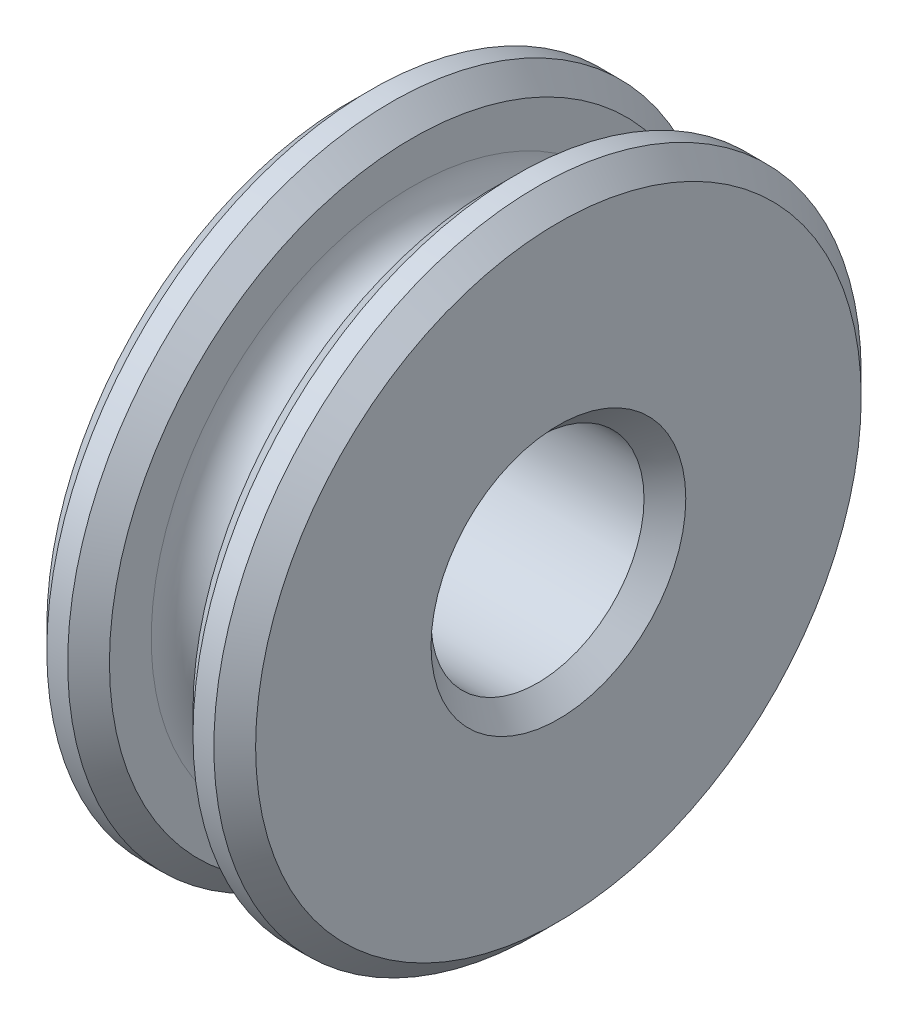
ISO-10303-21;
HEADER;
FILE_DESCRIPTION(('STEP AP214'),'2;1');
FILE_NAME('part.step','',(''),(''),'','','');
FILE_SCHEMA(('AUTOMOTIVE_DESIGN { 1 0 10303 214 1 1 1 1 }'));
ENDSEC;
DATA;
#1=APPLICATION_CONTEXT('core data for automotive mechanical design processes');
#2=APPLICATION_PROTOCOL_DEFINITION('international standard','automotive_design',2000,#1);
#3=PRODUCT_CONTEXT('',#1,'mechanical');
#4=PRODUCT('Part','Part','',(#3));
#5=PRODUCT_RELATED_PRODUCT_CATEGORY('part','',(#4));
#6=PRODUCT_DEFINITION_FORMATION('','',#4);
#7=PRODUCT_DEFINITION_CONTEXT('part definition',#1,'design');
#8=PRODUCT_DEFINITION('design','',#6,#7);
#9=PRODUCT_DEFINITION_SHAPE('','',#8);
#10=(LENGTH_UNIT() NAMED_UNIT(*) SI_UNIT(.MILLI.,.METRE.));
#11=(NAMED_UNIT(*) PLANE_ANGLE_UNIT() SI_UNIT($,.RADIAN.));
#12=(NAMED_UNIT(*) SI_UNIT($,.STERADIAN.) SOLID_ANGLE_UNIT());
#13=UNCERTAINTY_MEASURE_WITH_UNIT(LENGTH_MEASURE(1.E-05),#10,'distance_accuracy_value','');
#14=(GEOMETRIC_REPRESENTATION_CONTEXT(3) GLOBAL_UNCERTAINTY_ASSIGNED_CONTEXT((#13)) GLOBAL_UNIT_ASSIGNED_CONTEXT((#10,
#11,#12)) REPRESENTATION_CONTEXT('',''));
#15=CARTESIAN_POINT('',(0.,0.,0.));
#16=DIRECTION('',(0.,0.,1.));
#17=DIRECTION('',(1.,0.,0.));
#18=AXIS2_PLACEMENT_3D('',#15,#16,#17);
#19=CARTESIAN_POINT('',(-5.,0.,0.));
#20=DIRECTION('',(1.,0.,0.));
#21=DIRECTION('',(0.,0.,-1.));
#22=AXIS2_PLACEMENT_3D('',#19,#20,#21);
#23=TOROIDAL_SURFACE('',#22,12.5,2.);
#24=CARTESIAN_POINT('',(-3.,0.,0.));
#25=DIRECTION('',(1.,0.,0.));
#26=DIRECTION('',(0.,0.,-1.));
#27=AXIS2_PLACEMENT_3D('',#24,#25,#26);
#28=CIRCLE('',#27,12.5);
#29=CARTESIAN_POINT('',(-3.,0.,-12.5));
#30=VERTEX_POINT('',#29);
#31=EDGE_CURVE('E91',#30,#30,#28,.T.);
#32=ORIENTED_EDGE('',*,*,#31,.F.);
#33=EDGE_LOOP('',(#32));
#34=FACE_BOUND('',#33,.T.);
#35=CARTESIAN_POINT('',(-7.,0.,0.));
#36=DIRECTION('',(1.,0.,0.));
#37=DIRECTION('',(0.,0.,-1.));
#38=AXIS2_PLACEMENT_3D('',#35,#36,#37);
#39=CIRCLE('',#38,12.5);
#40=CARTESIAN_POINT('',(-7.,0.,-12.5));
#41=VERTEX_POINT('',#40);
#42=EDGE_CURVE('E88',#41,#41,#39,.T.);
#43=ORIENTED_EDGE('',*,*,#42,.T.);
#44=EDGE_LOOP('',(#43));
#45=FACE_BOUND('',#44,.T.);
#46=ADVANCED_FACE('F43',(#34,#45),#23,.F.);
#47=CARTESIAN_POINT('',(-7.,0.,0.));
#48=DIRECTION('',(1.,0.,0.));
#49=DIRECTION('',(0.,0.,-1.));
#50=AXIS2_PLACEMENT_3D('',#47,#48,#49);
#51=PLANE('',#50);
#52=CARTESIAN_POINT('',(-7.,0.,0.));
#53=DIRECTION('',(1.,0.,0.));
#54=DIRECTION('',(0.,0.,-1.));
#55=AXIS2_PLACEMENT_3D('',#52,#53,#54);
#56=CIRCLE('',#55,14.5);
#57=CARTESIAN_POINT('',(-7.,0.,-14.5));
#58=VERTEX_POINT('',#57);
#59=EDGE_CURVE('E64',#58,#58,#56,.T.);
#60=ORIENTED_EDGE('',*,*,#59,.T.);
#61=EDGE_LOOP('',(#60));
#62=FACE_BOUND('',#61,.T.);
#63=ORIENTED_EDGE('',*,*,#42,.F.);
#64=EDGE_LOOP('',(#63));
#65=FACE_BOUND('',#64,.T.);
#66=ADVANCED_FACE('F99',(#62,#65),#51,.T.);
#67=CARTESIAN_POINT('',(0.,0.,0.));
#68=DIRECTION('',(1.,0.,0.));
#69=DIRECTION('',(0.,0.,-1.));
#70=AXIS2_PLACEMENT_3D('',#67,#68,#69);
#71=CYLINDRICAL_SURFACE('',#70,15.5);
#72=CARTESIAN_POINT('',(-8.00000000000001,0.,0.));
#73=DIRECTION('',(1.,0.,0.));
#74=DIRECTION('',(0.,0.,-1.));
#75=AXIS2_PLACEMENT_3D('',#72,#73,#74);
#76=CIRCLE('',#75,15.5);
#77=CARTESIAN_POINT('',(-8.00000000000001,0.,-15.5));
#78=VERTEX_POINT('',#77);
#79=EDGE_CURVE('E55',#78,#78,#76,.F.);
#80=ORIENTED_EDGE('',*,*,#79,.T.);
#81=EDGE_LOOP('',(#80));
#82=FACE_BOUND('',#81,.T.);
#83=CARTESIAN_POINT('',(-9.00000000000001,0.,0.));
#84=DIRECTION('',(-1.,0.,0.));
#85=DIRECTION('',(0.,0.,1.));
#86=AXIS2_PLACEMENT_3D('',#83,#84,#85);
#87=CIRCLE('',#86,15.5);
#88=CARTESIAN_POINT('',(-9.00000000000001,0.,15.5));
#89=VERTEX_POINT('',#88);
#90=EDGE_CURVE('E59',#89,#89,#87,.F.);
#91=ORIENTED_EDGE('',*,*,#90,.T.);
#92=EDGE_LOOP('',(#91));
#93=FACE_BOUND('',#92,.T.);
#94=ADVANCED_FACE('F104',(#82,#93),#71,.T.);
#95=CARTESIAN_POINT('',(-10.,0.,0.));
#96=DIRECTION('',(-1.,0.,0.));
#97=DIRECTION('',(0.,0.,1.));
#98=AXIS2_PLACEMENT_3D('',#95,#96,#97);
#99=PLANE('',#98);
#100=CARTESIAN_POINT('',(-10.,0.,0.));
#101=DIRECTION('',(-1.,0.,0.));
#102=DIRECTION('',(0.,0.,1.));
#103=AXIS2_PLACEMENT_3D('',#100,#101,#102);
#104=CIRCLE('',#103,14.5);
#105=CARTESIAN_POINT('',(-10.,0.,14.5));
#106=VERTEX_POINT('',#105);
#107=EDGE_CURVE('E10',#106,#106,#104,.T.);
#108=ORIENTED_EDGE('',*,*,#107,.T.);
#109=EDGE_LOOP('',(#108));
#110=FACE_BOUND('',#109,.T.);
#111=CARTESIAN_POINT('',(-10.,0.,0.));
#112=DIRECTION('',(-1.,0.,0.));
#113=DIRECTION('',(0.,0.,1.));
#114=AXIS2_PLACEMENT_3D('',#111,#112,#113);
#115=CIRCLE('',#114,6.10000000000001);
#116=CARTESIAN_POINT('',(-10.,0.,6.10000000000001));
#117=VERTEX_POINT('',#116);
#118=EDGE_CURVE('E51',#117,#117,#115,.F.);
#119=ORIENTED_EDGE('',*,*,#118,.T.);
#120=EDGE_LOOP('',(#119));
#121=FACE_BOUND('',#120,.T.);
#122=ADVANCED_FACE('F111',(#110,#121),#99,.T.);
#123=CARTESIAN_POINT('',(0.,0.,0.));
#124=DIRECTION('',(1.,0.,0.));
#125=DIRECTION('',(0.,0.,-1.));
#126=AXIS2_PLACEMENT_3D('',#123,#124,#125);
#127=CYLINDRICAL_SURFACE('',#126,5.1);
#128=CARTESIAN_POINT('',(-1.00000000000001,0.,0.));
#129=DIRECTION('',(1.,0.,0.));
#130=DIRECTION('',(0.,0.,-1.));
#131=AXIS2_PLACEMENT_3D('',#128,#129,#130);
#132=CIRCLE('',#131,5.1);
#133=CARTESIAN_POINT('',(-1.00000000000001,0.,-5.1));
#134=VERTEX_POINT('',#133);
#135=EDGE_CURVE('E82',#134,#134,#132,.T.);
#136=ORIENTED_EDGE('',*,*,#135,.T.);
#137=EDGE_LOOP('',(#136));
#138=FACE_BOUND('',#137,.T.);
#139=CARTESIAN_POINT('',(-9.,0.,0.));
#140=DIRECTION('',(-1.,0.,0.));
#141=DIRECTION('',(0.,0.,1.));
#142=AXIS2_PLACEMENT_3D('',#139,#140,#141);
#143=CIRCLE('',#142,5.1);
#144=CARTESIAN_POINT('',(-9.,0.,5.1));
#145=VERTEX_POINT('',#144);
#146=EDGE_CURVE('E85',#145,#145,#143,.T.);
#147=ORIENTED_EDGE('',*,*,#146,.T.);
#148=EDGE_LOOP('',(#147));
#149=FACE_BOUND('',#148,.T.);
#150=ADVANCED_FACE('F161',(#138,#149),#127,.F.);
#151=CARTESIAN_POINT('',(0.,0.,0.));
#152=DIRECTION('',(1.,0.,0.));
#153=DIRECTION('',(0.,0.,-1.));
#154=AXIS2_PLACEMENT_3D('',#151,#152,#153);
#155=PLANE('',#154);
#156=CARTESIAN_POINT('',(0.,0.,0.));
#157=DIRECTION('',(1.,0.,0.));
#158=DIRECTION('',(0.,0.,-1.));
#159=AXIS2_PLACEMENT_3D('',#156,#157,#158);
#160=CIRCLE('',#159,6.10000000000001);
#161=CARTESIAN_POINT('',(0.,0.,-6.10000000000001));
#162=VERTEX_POINT('',#161);
#163=EDGE_CURVE('E76',#162,#162,#160,.F.);
#164=ORIENTED_EDGE('',*,*,#163,.T.);
#165=EDGE_LOOP('',(#164));
#166=FACE_BOUND('',#165,.T.);
#167=CARTESIAN_POINT('',(0.,0.,0.));
#168=DIRECTION('',(1.,0.,0.));
#169=DIRECTION('',(0.,0.,-1.));
#170=AXIS2_PLACEMENT_3D('',#167,#168,#169);
#171=CIRCLE('',#170,14.5);
#172=CARTESIAN_POINT('',(0.,0.,-14.5));
#173=VERTEX_POINT('',#172);
#174=EDGE_CURVE('E79',#173,#173,#171,.T.);
#175=ORIENTED_EDGE('',*,*,#174,.T.);
#176=EDGE_LOOP('',(#175));
#177=FACE_BOUND('',#176,.T.);
#178=ADVANCED_FACE('F163',(#166,#177),#155,.T.);
#179=CARTESIAN_POINT('',(0.,0.,0.));
#180=DIRECTION('',(1.,0.,0.));
#181=DIRECTION('',(0.,0.,-1.));
#182=AXIS2_PLACEMENT_3D('',#179,#180,#181);
#183=CYLINDRICAL_SURFACE('',#182,15.5);
#184=CARTESIAN_POINT('',(-1.00000000000001,0.,0.));
#185=DIRECTION('',(1.,0.,0.));
#186=DIRECTION('',(0.,0.,-1.));
#187=AXIS2_PLACEMENT_3D('',#184,#185,#186);
#188=CIRCLE('',#187,15.5);
#189=CARTESIAN_POINT('',(-1.00000000000001,0.,-15.5));
#190=VERTEX_POINT('',#189);
#191=EDGE_CURVE('E70',#190,#190,#188,.F.);
#192=ORIENTED_EDGE('',*,*,#191,.T.);
#193=EDGE_LOOP('',(#192));
#194=FACE_BOUND('',#193,.T.);
#195=CARTESIAN_POINT('',(-2.,0.,0.));
#196=DIRECTION('',(-1.,0.,0.));
#197=DIRECTION('',(0.,0.,1.));
#198=AXIS2_PLACEMENT_3D('',#195,#196,#197);
#199=CIRCLE('',#198,15.5);
#200=CARTESIAN_POINT('',(-2.,0.,15.5));
#201=VERTEX_POINT('',#200);
#202=EDGE_CURVE('E73',#201,#201,#199,.F.);
#203=ORIENTED_EDGE('',*,*,#202,.T.);
#204=EDGE_LOOP('',(#203));
#205=FACE_BOUND('',#204,.T.);
#206=ADVANCED_FACE('F170',(#194,#205),#183,.T.);
#207=CARTESIAN_POINT('',(-3.,0.,0.));
#208=DIRECTION('',(-1.,0.,0.));
#209=DIRECTION('',(0.,0.,1.));
#210=AXIS2_PLACEMENT_3D('',#207,#208,#209);
#211=PLANE('',#210);
#212=CARTESIAN_POINT('',(-3.,0.,0.));
#213=DIRECTION('',(-1.,0.,0.));
#214=DIRECTION('',(0.,0.,1.));
#215=AXIS2_PLACEMENT_3D('',#212,#213,#214);
#216=CIRCLE('',#215,14.5);
#217=CARTESIAN_POINT('',(-3.,0.,14.5));
#218=VERTEX_POINT('',#217);
#219=EDGE_CURVE('E67',#218,#218,#216,.T.);
#220=ORIENTED_EDGE('',*,*,#219,.T.);
#221=EDGE_LOOP('',(#220));
#222=FACE_BOUND('',#221,.T.);
#223=ORIENTED_EDGE('',*,*,#31,.T.);
#224=EDGE_LOOP('',(#223));
#225=FACE_BOUND('',#224,.T.);
#226=ADVANCED_FACE('F95',(#222,#225),#211,.T.);
#227=CARTESIAN_POINT('',(-1.00000000000001,0.,0.));
#228=DIRECTION('',(1.,0.,0.));
#229=DIRECTION('',(0.,0.,-1.));
#230=AXIS2_PLACEMENT_3D('',#227,#228,#229);
#231=CONICAL_SURFACE('',#230,5.1,0.785398163397447);
#232=ORIENTED_EDGE('',*,*,#163,.F.);
#233=EDGE_LOOP('',(#232));
#234=FACE_BOUND('',#233,.T.);
#235=ORIENTED_EDGE('',*,*,#135,.F.);
#236=EDGE_LOOP('',(#235));
#237=FACE_BOUND('',#236,.T.);
#238=ADVANCED_FACE('F117',(#234,#237),#231,.F.);
#239=CARTESIAN_POINT('',(0.,0.,0.));
#240=DIRECTION('',(-1.,0.,0.));
#241=DIRECTION('',(0.,0.,1.));
#242=AXIS2_PLACEMENT_3D('',#239,#240,#241);
#243=CONICAL_SURFACE('',#242,14.5,0.785398163397446);
#244=ORIENTED_EDGE('',*,*,#191,.F.);
#245=EDGE_LOOP('',(#244));
#246=FACE_BOUND('',#245,.T.);
#247=ORIENTED_EDGE('',*,*,#174,.F.);
#248=EDGE_LOOP('',(#247));
#249=FACE_BOUND('',#248,.T.);
#250=ADVANCED_FACE('F123',(#246,#249),#243,.T.);
#251=CARTESIAN_POINT('',(-2.,0.,0.));
#252=DIRECTION('',(1.,0.,0.));
#253=DIRECTION('',(0.,0.,-1.));
#254=AXIS2_PLACEMENT_3D('',#251,#252,#253);
#255=CONICAL_SURFACE('',#254,15.5,0.785398163397449);
#256=ORIENTED_EDGE('',*,*,#219,.F.);
#257=EDGE_LOOP('',(#256));
#258=FACE_BOUND('',#257,.T.);
#259=ORIENTED_EDGE('',*,*,#202,.F.);
#260=EDGE_LOOP('',(#259));
#261=FACE_BOUND('',#260,.T.);
#262=ADVANCED_FACE('F130',(#258,#261),#255,.T.);
#263=CARTESIAN_POINT('',(-7.,0.,0.));
#264=DIRECTION('',(-1.,0.,0.));
#265=DIRECTION('',(0.,0.,1.));
#266=AXIS2_PLACEMENT_3D('',#263,#264,#265);
#267=CONICAL_SURFACE('',#266,14.5,0.785398163397446);
#268=ORIENTED_EDGE('',*,*,#79,.F.);
#269=EDGE_LOOP('',(#268));
#270=FACE_BOUND('',#269,.T.);
#271=ORIENTED_EDGE('',*,*,#59,.F.);
#272=EDGE_LOOP('',(#271));
#273=FACE_BOUND('',#272,.T.);
#274=ADVANCED_FACE('F137',(#270,#273),#267,.T.);
#275=CARTESIAN_POINT('',(-9.00000000000001,0.,0.));
#276=DIRECTION('',(1.,0.,0.));
#277=DIRECTION('',(0.,0.,-1.));
#278=AXIS2_PLACEMENT_3D('',#275,#276,#277);
#279=CONICAL_SURFACE('',#278,15.5,0.785398163397449);
#280=ORIENTED_EDGE('',*,*,#107,.F.);
#281=EDGE_LOOP('',(#280));
#282=FACE_BOUND('',#281,.T.);
#283=ORIENTED_EDGE('',*,*,#90,.F.);
#284=EDGE_LOOP('',(#283));
#285=FACE_BOUND('',#284,.T.);
#286=ADVANCED_FACE('F143',(#282,#285),#279,.T.);
#287=CARTESIAN_POINT('',(-10.,0.,0.));
#288=DIRECTION('',(-1.,0.,0.));
#289=DIRECTION('',(0.,0.,1.));
#290=AXIS2_PLACEMENT_3D('',#287,#288,#289);
#291=CONICAL_SURFACE('',#290,6.10000000000001,0.785398163397448);
#292=ORIENTED_EDGE('',*,*,#146,.F.);
#293=EDGE_LOOP('',(#292));
#294=FACE_BOUND('',#293,.T.);
#295=ORIENTED_EDGE('',*,*,#118,.F.);
#296=EDGE_LOOP('',(#295));
#297=FACE_BOUND('',#296,.T.);
#298=ADVANCED_FACE('F46',(#294,#297),#291,.F.);
#299=CLOSED_SHELL('',(#46,#66,#94,#122,#150,#178,#206,#226,#238,#250,#262,#274,#286,#298));
#300=MANIFOLD_SOLID_BREP('B2',#299);
#301=ADVANCED_BREP_SHAPE_REPRESENTATION('',(#18,#300),#14);
#302=SHAPE_DEFINITION_REPRESENTATION(#9,#301);
ENDSEC;
END-ISO-10303-21;
